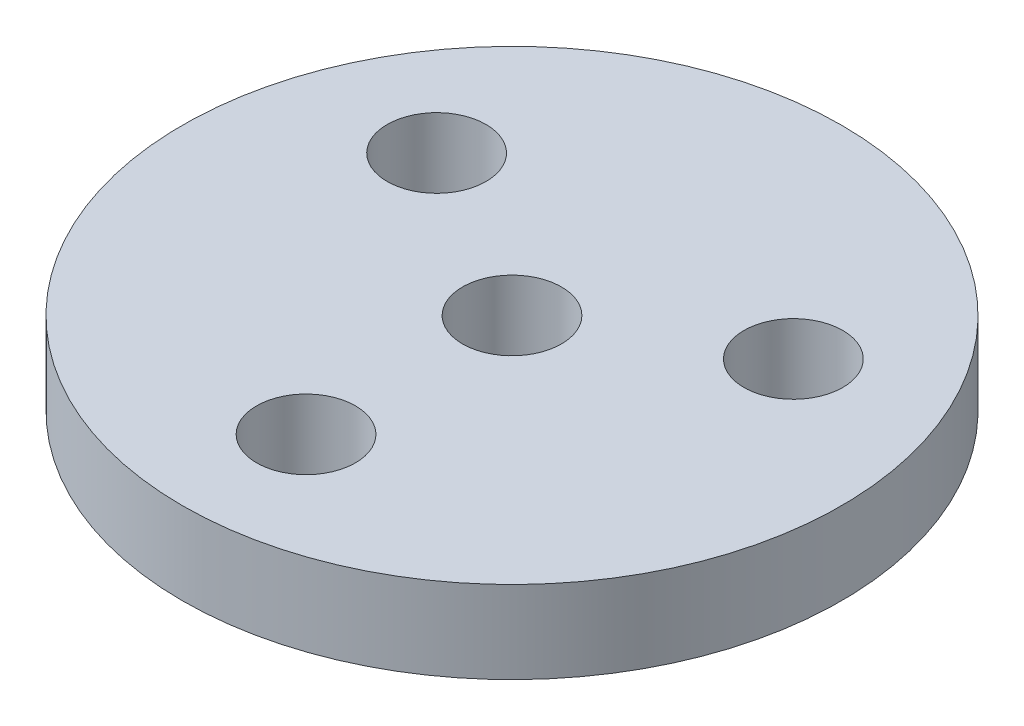
ISO-10303-21;
HEADER;
FILE_DESCRIPTION(('STEP AP214'),'2;1');
FILE_NAME('part.step','',(''),(''),'','','');
FILE_SCHEMA(('AUTOMOTIVE_DESIGN { 1 0 10303 214 1 1 1 1 }'));
ENDSEC;
DATA;
#1=APPLICATION_CONTEXT('core data for automotive mechanical design processes');
#2=APPLICATION_PROTOCOL_DEFINITION('international standard','automotive_design',2000,#1);
#3=PRODUCT_CONTEXT('',#1,'mechanical');
#4=PRODUCT('Part','Part','',(#3));
#5=PRODUCT_RELATED_PRODUCT_CATEGORY('part','',(#4));
#6=PRODUCT_DEFINITION_FORMATION('','',#4);
#7=PRODUCT_DEFINITION_CONTEXT('part definition',#1,'design');
#8=PRODUCT_DEFINITION('design','',#6,#7);
#9=PRODUCT_DEFINITION_SHAPE('','',#8);
#10=(LENGTH_UNIT() NAMED_UNIT(*) SI_UNIT(.MILLI.,.METRE.));
#11=(NAMED_UNIT(*) PLANE_ANGLE_UNIT() SI_UNIT($,.RADIAN.));
#12=(NAMED_UNIT(*) SI_UNIT($,.STERADIAN.) SOLID_ANGLE_UNIT());
#13=UNCERTAINTY_MEASURE_WITH_UNIT(LENGTH_MEASURE(1.E-05),#10,'distance_accuracy_value','');
#14=(GEOMETRIC_REPRESENTATION_CONTEXT(3) GLOBAL_UNCERTAINTY_ASSIGNED_CONTEXT((#13)) GLOBAL_UNIT_ASSIGNED_CONTEXT((#10,
#11,#12)) REPRESENTATION_CONTEXT('',''));
#15=CARTESIAN_POINT('',(0.,0.,0.));
#16=DIRECTION('',(0.,0.,1.));
#17=DIRECTION('',(1.,0.,0.));
#18=AXIS2_PLACEMENT_3D('',#15,#16,#17);
#19=CARTESIAN_POINT('',(0.,2.,0.));
#20=DIRECTION('',(0.,1.,0.));
#21=DIRECTION('',(0.,0.,1.));
#22=AXIS2_PLACEMENT_3D('',#19,#20,#21);
#23=PLANE('',#22);
#24=CARTESIAN_POINT('',(-4.33012701892218,2.,-2.50000000000002));
#25=DIRECTION('',(0.,-1.,0.));
#26=DIRECTION('',(0.866025403784436,0.,0.500000000000004));
#27=AXIS2_PLACEMENT_3D('',#24,#25,#26);
#28=CIRCLE('',#27,1.2);
#29=CARTESIAN_POINT('',(-3.29089653438086,2.,-1.90000000000002));
#30=VERTEX_POINT('',#29);
#31=EDGE_CURVE('E65',#30,#30,#28,.T.);
#32=ORIENTED_EDGE('',*,*,#31,.T.);
#33=EDGE_LOOP('',(#32));
#34=FACE_BOUND('',#33,.T.);
#35=CARTESIAN_POINT('',(4.33012701892222,2.,-2.49999999999996));
#36=DIRECTION('',(0.,-1.,0.));
#37=DIRECTION('',(-0.866025403784443,0.,0.499999999999992));
#38=AXIS2_PLACEMENT_3D('',#35,#36,#37);
#39=CIRCLE('',#38,1.2);
#40=CARTESIAN_POINT('',(3.29089653438089,2.,-1.89999999999997));
#41=VERTEX_POINT('',#40);
#42=EDGE_CURVE('E71',#41,#41,#39,.T.);
#43=ORIENTED_EDGE('',*,*,#42,.T.);
#44=EDGE_LOOP('',(#43));
#45=FACE_BOUND('',#44,.T.);
#46=CARTESIAN_POINT('',(0.,2.,5.));
#47=DIRECTION('',(0.,-1.,0.));
#48=DIRECTION('',(0.,0.,-1.));
#49=AXIS2_PLACEMENT_3D('',#46,#47,#48);
#50=CIRCLE('',#49,1.2);
#51=CARTESIAN_POINT('',(0.,2.,3.8));
#52=VERTEX_POINT('',#51);
#53=EDGE_CURVE('E59',#52,#52,#50,.T.);
#54=ORIENTED_EDGE('',*,*,#53,.T.);
#55=EDGE_LOOP('',(#54));
#56=FACE_BOUND('',#55,.T.);
#57=CARTESIAN_POINT('',(0.,2.,0.));
#58=DIRECTION('',(0.,1.,0.));
#59=DIRECTION('',(0.,0.,1.));
#60=AXIS2_PLACEMENT_3D('',#57,#58,#59);
#61=CIRCLE('',#60,8.);
#62=CARTESIAN_POINT('',(0.,2.,8.));
#63=VERTEX_POINT('',#62);
#64=EDGE_CURVE('E11',#63,#63,#61,.T.);
#65=ORIENTED_EDGE('',*,*,#64,.T.);
#66=EDGE_LOOP('',(#65));
#67=FACE_BOUND('',#66,.T.);
#68=CARTESIAN_POINT('',(0.,2.,0.));
#69=DIRECTION('',(0.,1.,0.));
#70=DIRECTION('',(0.,0.,1.));
#71=AXIS2_PLACEMENT_3D('',#68,#69,#70);
#72=CIRCLE('',#71,1.2);
#73=CARTESIAN_POINT('',(0.,2.,1.2));
#74=VERTEX_POINT('',#73);
#75=EDGE_CURVE('E54',#74,#74,#72,.T.);
#76=ORIENTED_EDGE('',*,*,#75,.F.);
#77=EDGE_LOOP('',(#76));
#78=FACE_BOUND('',#77,.T.);
#79=ADVANCED_FACE('F43',(#34,#45,#56,#67,#78),#23,.T.);
#80=CARTESIAN_POINT('',(0.,0.,0.));
#81=DIRECTION('',(0.,1.,0.));
#82=DIRECTION('',(0.,0.,1.));
#83=AXIS2_PLACEMENT_3D('',#80,#81,#82);
#84=PLANE('',#83);
#85=CARTESIAN_POINT('',(-4.33012701892218,0.,-2.50000000000002));
#86=DIRECTION('',(0.,-1.,0.));
#87=DIRECTION('',(0.866025403784436,0.,0.500000000000004));
#88=AXIS2_PLACEMENT_3D('',#85,#86,#87);
#89=CIRCLE('',#88,1.2);
#90=CARTESIAN_POINT('',(-3.29089653438086,0.,-1.90000000000002));
#91=VERTEX_POINT('',#90);
#92=EDGE_CURVE('E74',#91,#91,#89,.T.);
#93=ORIENTED_EDGE('',*,*,#92,.F.);
#94=EDGE_LOOP('',(#93));
#95=FACE_BOUND('',#94,.T.);
#96=CARTESIAN_POINT('',(4.33012701892222,0.,-2.49999999999996));
#97=DIRECTION('',(0.,-1.,0.));
#98=DIRECTION('',(-0.866025403784443,0.,0.499999999999992));
#99=AXIS2_PLACEMENT_3D('',#96,#97,#98);
#100=CIRCLE('',#99,1.2);
#101=CARTESIAN_POINT('',(3.29089653438089,0.,-1.89999999999997));
#102=VERTEX_POINT('',#101);
#103=EDGE_CURVE('E68',#102,#102,#100,.T.);
#104=ORIENTED_EDGE('',*,*,#103,.F.);
#105=EDGE_LOOP('',(#104));
#106=FACE_BOUND('',#105,.T.);
#107=CARTESIAN_POINT('',(0.,0.,5.));
#108=DIRECTION('',(0.,-1.,0.));
#109=DIRECTION('',(0.,0.,-1.));
#110=AXIS2_PLACEMENT_3D('',#107,#108,#109);
#111=CIRCLE('',#110,1.2);
#112=CARTESIAN_POINT('',(0.,0.,3.8));
#113=VERTEX_POINT('',#112);
#114=EDGE_CURVE('E62',#113,#113,#111,.T.);
#115=ORIENTED_EDGE('',*,*,#114,.F.);
#116=EDGE_LOOP('',(#115));
#117=FACE_BOUND('',#116,.T.);
#118=CARTESIAN_POINT('',(0.,0.,0.));
#119=DIRECTION('',(0.,1.,0.));
#120=DIRECTION('',(0.,0.,1.));
#121=AXIS2_PLACEMENT_3D('',#118,#119,#120);
#122=CIRCLE('',#121,8.);
#123=CARTESIAN_POINT('',(0.,0.,8.));
#124=VERTEX_POINT('',#123);
#125=EDGE_CURVE('E47',#124,#124,#122,.T.);
#126=ORIENTED_EDGE('',*,*,#125,.F.);
#127=EDGE_LOOP('',(#126));
#128=FACE_BOUND('',#127,.T.);
#129=CARTESIAN_POINT('',(0.,0.,0.));
#130=DIRECTION('',(0.,1.,0.));
#131=DIRECTION('',(0.,0.,1.));
#132=AXIS2_PLACEMENT_3D('',#129,#130,#131);
#133=CIRCLE('',#132,1.2);
#134=CARTESIAN_POINT('',(0.,0.,1.2));
#135=VERTEX_POINT('',#134);
#136=EDGE_CURVE('E56',#135,#135,#133,.T.);
#137=ORIENTED_EDGE('',*,*,#136,.T.);
#138=EDGE_LOOP('',(#137));
#139=FACE_BOUND('',#138,.T.);
#140=ADVANCED_FACE('F89',(#95,#106,#117,#128,#139),#84,.F.);
#141=CARTESIAN_POINT('',(0.,2.,0.));
#142=DIRECTION('',(0.,-1.,0.));
#143=DIRECTION('',(0.,0.,-1.));
#144=AXIS2_PLACEMENT_3D('',#141,#142,#143);
#145=CYLINDRICAL_SURFACE('',#144,8.);
#146=ORIENTED_EDGE('',*,*,#64,.F.);
#147=EDGE_LOOP('',(#146));
#148=FACE_BOUND('',#147,.T.);
#149=ORIENTED_EDGE('',*,*,#125,.T.);
#150=EDGE_LOOP('',(#149));
#151=FACE_BOUND('',#150,.T.);
#152=ADVANCED_FACE('F45',(#148,#151),#145,.T.);
#153=CARTESIAN_POINT('',(0.,2.,0.));
#154=DIRECTION('',(0.,-1.,0.));
#155=DIRECTION('',(0.,0.,-1.));
#156=AXIS2_PLACEMENT_3D('',#153,#154,#155);
#157=CYLINDRICAL_SURFACE('',#156,1.2);
#158=ORIENTED_EDGE('',*,*,#75,.T.);
#159=EDGE_LOOP('',(#158));
#160=FACE_BOUND('',#159,.T.);
#161=ORIENTED_EDGE('',*,*,#136,.F.);
#162=EDGE_LOOP('',(#161));
#163=FACE_BOUND('',#162,.T.);
#164=ADVANCED_FACE('F100',(#160,#163),#157,.F.);
#165=CARTESIAN_POINT('',(0.,2.,5.));
#166=DIRECTION('',(0.,-1.,0.));
#167=DIRECTION('',(0.,0.,-1.));
#168=AXIS2_PLACEMENT_3D('',#165,#166,#167);
#169=CYLINDRICAL_SURFACE('',#168,1.2);
#170=ORIENTED_EDGE('',*,*,#53,.F.);
#171=EDGE_LOOP('',(#170));
#172=FACE_BOUND('',#171,.T.);
#173=ORIENTED_EDGE('',*,*,#114,.T.);
#174=EDGE_LOOP('',(#173));
#175=FACE_BOUND('',#174,.T.);
#176=ADVANCED_FACE('F102',(#172,#175),#169,.F.);
#177=CARTESIAN_POINT('',(4.33012701892222,2.,-2.49999999999996));
#178=DIRECTION('',(0.,-1.,0.));
#179=DIRECTION('',(0.,0.,-1.));
#180=AXIS2_PLACEMENT_3D('',#177,#178,#179);
#181=CYLINDRICAL_SURFACE('',#180,1.2);
#182=ORIENTED_EDGE('',*,*,#42,.F.);
#183=EDGE_LOOP('',(#182));
#184=FACE_BOUND('',#183,.T.);
#185=ORIENTED_EDGE('',*,*,#103,.T.);
#186=EDGE_LOOP('',(#185));
#187=FACE_BOUND('',#186,.T.);
#188=ADVANCED_FACE('F85',(#184,#187),#181,.F.);
#189=CARTESIAN_POINT('',(-4.33012701892218,2.,-2.50000000000002));
#190=DIRECTION('',(0.,-1.,0.));
#191=DIRECTION('',(0.,0.,-1.));
#192=AXIS2_PLACEMENT_3D('',#189,#190,#191);
#193=CYLINDRICAL_SURFACE('',#192,1.2);
#194=ORIENTED_EDGE('',*,*,#31,.F.);
#195=EDGE_LOOP('',(#194));
#196=FACE_BOUND('',#195,.T.);
#197=ORIENTED_EDGE('',*,*,#92,.T.);
#198=EDGE_LOOP('',(#197));
#199=FACE_BOUND('',#198,.T.);
#200=ADVANCED_FACE('F82',(#196,#199),#193,.F.);
#201=CLOSED_SHELL('',(#79,#140,#152,#164,#176,#188,#200));
#202=MANIFOLD_SOLID_BREP('B2',#201);
#203=ADVANCED_BREP_SHAPE_REPRESENTATION('',(#18,#202),#14);
#204=SHAPE_DEFINITION_REPRESENTATION(#9,#203);
ENDSEC;
END-ISO-10303-21;
